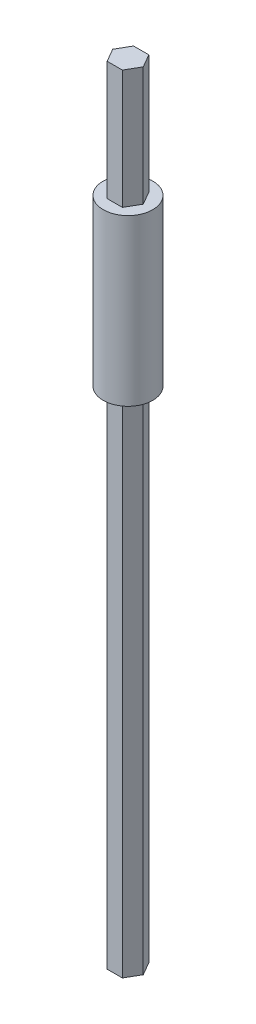
ISO-10303-21;
HEADER;
FILE_DESCRIPTION(('STEP AP214'),'2;1');
FILE_NAME('part.step','',(''),(''),'','','');
FILE_SCHEMA(('AUTOMOTIVE_DESIGN { 1 0 10303 214 1 1 1 1 }'));
ENDSEC;
DATA;
#1=APPLICATION_CONTEXT('core data for automotive mechanical design processes');
#2=APPLICATION_PROTOCOL_DEFINITION('international standard','automotive_design',2000,#1);
#3=PRODUCT_CONTEXT('',#1,'mechanical');
#4=PRODUCT('Part','Part','',(#3));
#5=PRODUCT_RELATED_PRODUCT_CATEGORY('part','',(#4));
#6=PRODUCT_DEFINITION_FORMATION('','',#4);
#7=PRODUCT_DEFINITION_CONTEXT('part definition',#1,'design');
#8=PRODUCT_DEFINITION('design','',#6,#7);
#9=PRODUCT_DEFINITION_SHAPE('','',#8);
#10=(LENGTH_UNIT() NAMED_UNIT(*) SI_UNIT(.MILLI.,.METRE.));
#11=(NAMED_UNIT(*) PLANE_ANGLE_UNIT() SI_UNIT($,.RADIAN.));
#12=(NAMED_UNIT(*) SI_UNIT($,.STERADIAN.) SOLID_ANGLE_UNIT());
#13=UNCERTAINTY_MEASURE_WITH_UNIT(LENGTH_MEASURE(1.E-05),#10,'distance_accuracy_value','');
#14=(GEOMETRIC_REPRESENTATION_CONTEXT(3) GLOBAL_UNCERTAINTY_ASSIGNED_CONTEXT((#13)) GLOBAL_UNIT_ASSIGNED_CONTEXT((#10,
#11,#12)) REPRESENTATION_CONTEXT('',''));
#15=CARTESIAN_POINT('',(0.,0.,0.));
#16=DIRECTION('',(0.,0.,1.));
#17=DIRECTION('',(1.,0.,0.));
#18=AXIS2_PLACEMENT_3D('',#15,#16,#17);
#19=CARTESIAN_POINT('',(1.5556349186104,71.3,-1.5556349186104));
#20=DIRECTION('',(0.,1.,0.));
#21=DIRECTION('',(0.,0.,1.));
#22=AXIS2_PLACEMENT_3D('',#19,#20,#21);
#23=PLANE('',#22);
#24=CARTESIAN_POINT('',(1.5556349186104,71.3,-1.5556349186104));
#25=DIRECTION('',(0.,1.,0.));
#26=DIRECTION('',(0.,0.,1.));
#27=AXIS2_PLACEMENT_3D('',#24,#25,#26);
#28=CIRCLE('',#27,3.75);
#29=CARTESIAN_POINT('',(1.5556349186104,71.3,2.1943650813896));
#30=VERTEX_POINT('',#29);
#31=EDGE_CURVE('E37',#30,#30,#28,.T.);
#32=ORIENTED_EDGE('',*,*,#31,.F.);
#33=EDGE_LOOP('',(#32));
#34=FACE_BOUND('',#33,.T.);
#35=DIRECTION('',(0.5,0.,0.866025403784439));
#36=VECTOR('',#35,1.);
#37=CARTESIAN_POINT('',(2.71033545698966,71.3,-3.55563491861041));
#38=LINE('',#37,#36);
#39=CARTESIAN_POINT('',(2.71033545698966,71.3,-3.55563491861041));
#40=VERTEX_POINT('',#39);
#41=CARTESIAN_POINT('',(3.86503599536891,71.3,-1.5556349186104));
#42=VERTEX_POINT('',#41);
#43=EDGE_CURVE('E142',#40,#42,#38,.T.);
#44=ORIENTED_EDGE('',*,*,#43,.F.);
#45=DIRECTION('',(1.,0.,0.));
#46=VECTOR('',#45,1.);
#47=CARTESIAN_POINT('',(0.400934380231152,71.3,-3.5556349186104));
#48=LINE('',#47,#46);
#49=CARTESIAN_POINT('',(0.400934380231152,71.3,-3.55563491861041));
#50=VERTEX_POINT('',#49);
#51=EDGE_CURVE('E139',#50,#40,#48,.T.);
#52=ORIENTED_EDGE('',*,*,#51,.F.);
#53=DIRECTION('',(0.5,0.,-0.866025403784438));
#54=VECTOR('',#53,1.);
#55=CARTESIAN_POINT('',(-0.7537661581481,71.3,-1.55563491861041));
#56=LINE('',#55,#54);
#57=CARTESIAN_POINT('',(-0.753766158148099,71.3,-1.55563491861041));
#58=VERTEX_POINT('',#57);
#59=EDGE_CURVE('E207',#58,#50,#56,.T.);
#60=ORIENTED_EDGE('',*,*,#59,.F.);
#61=DIRECTION('',(-0.5,0.,-0.866025403784439));
#62=VECTOR('',#61,1.);
#63=CARTESIAN_POINT('',(0.400934380231152,71.3,0.444365081389597));
#64=LINE('',#63,#62);
#65=CARTESIAN_POINT('',(0.400934380231153,71.3,0.444365081389597));
#66=VERTEX_POINT('',#65);
#67=EDGE_CURVE('E224',#66,#58,#64,.T.);
#68=ORIENTED_EDGE('',*,*,#67,.F.);
#69=DIRECTION('',(-1.,0.,0.));
#70=VECTOR('',#69,1.);
#71=CARTESIAN_POINT('',(2.71033545698965,71.3,0.444365081389597));
#72=LINE('',#71,#70);
#73=CARTESIAN_POINT('',(2.71033545698965,71.3,0.444365081389597));
#74=VERTEX_POINT('',#73);
#75=EDGE_CURVE('E53',#74,#66,#72,.T.);
#76=ORIENTED_EDGE('',*,*,#75,.F.);
#77=DIRECTION('',(-0.5,0.,0.866025403784438));
#78=VECTOR('',#77,1.);
#79=CARTESIAN_POINT('',(3.86503599536891,71.3,-1.5556349186104));
#80=LINE('',#79,#78);
#81=EDGE_CURVE('E48',#42,#74,#80,.T.);
#82=ORIENTED_EDGE('',*,*,#81,.F.);
#83=EDGE_LOOP('',(#44,#52,#60,#68,#76,#82));
#84=FACE_BOUND('',#83,.T.);
#85=ADVANCED_FACE('F33',(#34,#84),#23,.F.);
#86=CARTESIAN_POINT('',(1.5556349186104,96.3,-1.5556349186104));
#87=DIRECTION('',(0.,1.,0.));
#88=DIRECTION('',(0.,0.,1.));
#89=AXIS2_PLACEMENT_3D('',#86,#87,#88);
#90=PLANE('',#89);
#91=CARTESIAN_POINT('',(1.5556349186104,96.3,-1.5556349186104));
#92=DIRECTION('',(0.,1.,0.));
#93=DIRECTION('',(0.,0.,1.));
#94=AXIS2_PLACEMENT_3D('',#91,#92,#93);
#95=CIRCLE('',#94,3.75);
#96=CARTESIAN_POINT('',(1.5556349186104,96.3,2.1943650813896));
#97=VERTEX_POINT('',#96);
#98=EDGE_CURVE('E11',#97,#97,#95,.T.);
#99=ORIENTED_EDGE('',*,*,#98,.T.);
#100=EDGE_LOOP('',(#99));
#101=FACE_BOUND('',#100,.T.);
#102=DIRECTION('',(-0.5,0.,-0.866025403784439));
#103=VECTOR('',#102,1.);
#104=CARTESIAN_POINT('',(3.86503599536891,96.3,-1.55563491861041));
#105=LINE('',#104,#103);
#106=CARTESIAN_POINT('',(3.86503599536891,96.3,-1.55563491861041));
#107=VERTEX_POINT('',#106);
#108=CARTESIAN_POINT('',(2.71033545698966,96.3,-3.55563491861041));
#109=VERTEX_POINT('',#108);
#110=EDGE_CURVE('E146',#107,#109,#105,.T.);
#111=ORIENTED_EDGE('',*,*,#110,.F.);
#112=DIRECTION('',(0.5,0.,-0.866025403784439));
#113=VECTOR('',#112,1.);
#114=CARTESIAN_POINT('',(2.71033545698966,96.3,0.444365081389596));
#115=LINE('',#114,#113);
#116=CARTESIAN_POINT('',(2.71033545698966,96.3,0.444365081389596));
#117=VERTEX_POINT('',#116);
#118=EDGE_CURVE('E143',#117,#107,#115,.T.);
#119=ORIENTED_EDGE('',*,*,#118,.F.);
#120=DIRECTION('',(1.,0.,0.));
#121=VECTOR('',#120,1.);
#122=CARTESIAN_POINT('',(0.400934380231153,96.3,0.444365081389596));
#123=LINE('',#122,#121);
#124=CARTESIAN_POINT('',(0.400934380231152,96.3,0.444365081389596));
#125=VERTEX_POINT('',#124);
#126=EDGE_CURVE('E156',#125,#117,#123,.T.);
#127=ORIENTED_EDGE('',*,*,#126,.F.);
#128=DIRECTION('',(0.5,0.,0.866025403784438));
#129=VECTOR('',#128,1.);
#130=CARTESIAN_POINT('',(-0.753766158148099,96.3,-1.5556349186104));
#131=LINE('',#130,#129);
#132=CARTESIAN_POINT('',(-0.753766158148099,96.3,-1.5556349186104));
#133=VERTEX_POINT('',#132);
#134=EDGE_CURVE('E172',#133,#125,#131,.T.);
#135=ORIENTED_EDGE('',*,*,#134,.F.);
#136=DIRECTION('',(-0.5,0.,0.866025403784439));
#137=VECTOR('',#136,1.);
#138=CARTESIAN_POINT('',(0.400934380231153,96.3,-3.55563491861041));
#139=LINE('',#138,#137);
#140=CARTESIAN_POINT('',(0.400934380231153,96.3,-3.55563491861041));
#141=VERTEX_POINT('',#140);
#142=EDGE_CURVE('E170',#141,#133,#139,.T.);
#143=ORIENTED_EDGE('',*,*,#142,.F.);
#144=DIRECTION('',(-1.,0.,0.));
#145=VECTOR('',#144,1.);
#146=CARTESIAN_POINT('',(2.71033545698966,96.3,-3.55563491861041));
#147=LINE('',#146,#145);
#148=EDGE_CURVE('E168',#109,#141,#147,.T.);
#149=ORIENTED_EDGE('',*,*,#148,.F.);
#150=EDGE_LOOP('',(#111,#119,#127,#135,#143,#149));
#151=FACE_BOUND('',#150,.T.);
#152=ADVANCED_FACE('F197',(#101,#151),#90,.T.);
#153=CARTESIAN_POINT('',(1.5556349186104,96.3,-1.5556349186104));
#154=DIRECTION('',(0.,-1.,0.));
#155=DIRECTION('',(0.,0.,-1.));
#156=AXIS2_PLACEMENT_3D('',#153,#154,#155);
#157=CYLINDRICAL_SURFACE('',#156,3.75);
#158=ORIENTED_EDGE('',*,*,#98,.F.);
#159=EDGE_LOOP('',(#158));
#160=FACE_BOUND('',#159,.T.);
#161=ORIENTED_EDGE('',*,*,#31,.T.);
#162=EDGE_LOOP('',(#161));
#163=FACE_BOUND('',#162,.T.);
#164=ADVANCED_FACE('F35',(#160,#163),#157,.T.);
#165=CARTESIAN_POINT('',(2.71033545698966,114.3,0.444365081389596));
#166=DIRECTION('',(-0.866025403784439,0.,-0.5));
#167=DIRECTION('',(-0.5,0.,0.866025403784439));
#168=AXIS2_PLACEMENT_3D('',#165,#166,#167);
#169=PLANE('',#168);
#170=ORIENTED_EDGE('',*,*,#118,.T.);
#171=DIRECTION('',(0.,-1.,0.));
#172=VECTOR('',#171,1.);
#173=CARTESIAN_POINT('',(3.86503599536891,114.3,-1.55563491861041));
#174=LINE('',#173,#172);
#175=CARTESIAN_POINT('',(3.86503599536891,114.3,-1.55563491861041));
#176=VERTEX_POINT('',#175);
#177=EDGE_CURVE('E189',#176,#107,#174,.T.);
#178=ORIENTED_EDGE('',*,*,#177,.F.);
#179=DIRECTION('',(0.5,0.,-0.866025403784439));
#180=VECTOR('',#179,1.);
#181=CARTESIAN_POINT('',(2.71033545698966,114.3,0.444365081389596));
#182=LINE('',#181,#180);
#183=CARTESIAN_POINT('',(2.71033545698966,114.3,0.444365081389596));
#184=VERTEX_POINT('',#183);
#185=EDGE_CURVE('E152',#184,#176,#182,.T.);
#186=ORIENTED_EDGE('',*,*,#185,.F.);
#187=DIRECTION('',(0.,-1.,0.));
#188=VECTOR('',#187,1.);
#189=CARTESIAN_POINT('',(2.71033545698966,114.3,0.444365081389596));
#190=LINE('',#189,#188);
#191=EDGE_CURVE('E165',#184,#117,#190,.T.);
#192=ORIENTED_EDGE('',*,*,#191,.T.);
#193=EDGE_LOOP('',(#170,#178,#186,#192));
#194=FACE_BOUND('',#193,.T.);
#195=ADVANCED_FACE('F276',(#194),#169,.F.);
#196=CARTESIAN_POINT('',(3.86503599536891,114.3,-1.55563491861041));
#197=DIRECTION('',(-0.866025403784439,0.,0.5));
#198=DIRECTION('',(0.5,0.,0.866025403784439));
#199=AXIS2_PLACEMENT_3D('',#196,#197,#198);
#200=PLANE('',#199);
#201=ORIENTED_EDGE('',*,*,#110,.T.);
#202=DIRECTION('',(0.,-1.,0.));
#203=VECTOR('',#202,1.);
#204=CARTESIAN_POINT('',(2.71033545698966,114.3,-3.55563491861041));
#205=LINE('',#204,#203);
#206=CARTESIAN_POINT('',(2.71033545698966,114.3,-3.55563491861041));
#207=VERTEX_POINT('',#206);
#208=EDGE_CURVE('E186',#207,#109,#205,.T.);
#209=ORIENTED_EDGE('',*,*,#208,.F.);
#210=DIRECTION('',(-0.5,0.,-0.866025403784439));
#211=VECTOR('',#210,1.);
#212=CARTESIAN_POINT('',(3.86503599536891,114.3,-1.55563491861041));
#213=LINE('',#212,#211);
#214=EDGE_CURVE('E155',#176,#207,#213,.T.);
#215=ORIENTED_EDGE('',*,*,#214,.F.);
#216=ORIENTED_EDGE('',*,*,#177,.T.);
#217=EDGE_LOOP('',(#201,#209,#215,#216));
#218=FACE_BOUND('',#217,.T.);
#219=ADVANCED_FACE('F272',(#218),#200,.F.);
#220=CARTESIAN_POINT('',(2.71033545698966,114.3,-3.55563491861041));
#221=DIRECTION('',(0.,0.,1.));
#222=DIRECTION('',(1.,0.,0.));
#223=AXIS2_PLACEMENT_3D('',#220,#221,#222);
#224=PLANE('',#223);
#225=ORIENTED_EDGE('',*,*,#148,.T.);
#226=DIRECTION('',(0.,-1.,0.));
#227=VECTOR('',#226,1.);
#228=CARTESIAN_POINT('',(0.400934380231153,114.3,-3.55563491861041));
#229=LINE('',#228,#227);
#230=CARTESIAN_POINT('',(0.400934380231153,114.3,-3.55563491861041));
#231=VERTEX_POINT('',#230);
#232=EDGE_CURVE('E183',#231,#141,#229,.T.);
#233=ORIENTED_EDGE('',*,*,#232,.F.);
#234=DIRECTION('',(-1.,0.,0.));
#235=VECTOR('',#234,1.);
#236=CARTESIAN_POINT('',(2.71033545698966,114.3,-3.55563491861041));
#237=LINE('',#236,#235);
#238=EDGE_CURVE('E158',#207,#231,#237,.T.);
#239=ORIENTED_EDGE('',*,*,#238,.F.);
#240=ORIENTED_EDGE('',*,*,#208,.T.);
#241=EDGE_LOOP('',(#225,#233,#239,#240));
#242=FACE_BOUND('',#241,.T.);
#243=ADVANCED_FACE('F268',(#242),#224,.F.);
#244=CARTESIAN_POINT('',(0.400934380231153,114.3,-3.55563491861041));
#245=DIRECTION('',(0.866025403784439,0.,0.5));
#246=DIRECTION('',(0.5,0.,-0.866025403784439));
#247=AXIS2_PLACEMENT_3D('',#244,#245,#246);
#248=PLANE('',#247);
#249=ORIENTED_EDGE('',*,*,#142,.T.);
#250=DIRECTION('',(0.,-1.,0.));
#251=VECTOR('',#250,1.);
#252=CARTESIAN_POINT('',(-0.753766158148099,114.3,-1.5556349186104));
#253=LINE('',#252,#251);
#254=CARTESIAN_POINT('',(-0.753766158148099,114.3,-1.5556349186104));
#255=VERTEX_POINT('',#254);
#256=EDGE_CURVE('E180',#255,#133,#253,.T.);
#257=ORIENTED_EDGE('',*,*,#256,.F.);
#258=DIRECTION('',(-0.5,0.,0.866025403784439));
#259=VECTOR('',#258,1.);
#260=CARTESIAN_POINT('',(0.400934380231153,114.3,-3.55563491861041));
#261=LINE('',#260,#259);
#262=EDGE_CURVE('E160',#231,#255,#261,.T.);
#263=ORIENTED_EDGE('',*,*,#262,.F.);
#264=ORIENTED_EDGE('',*,*,#232,.T.);
#265=EDGE_LOOP('',(#249,#257,#263,#264));
#266=FACE_BOUND('',#265,.T.);
#267=ADVANCED_FACE('F264',(#266),#248,.F.);
#268=CARTESIAN_POINT('',(-0.753766158148099,114.3,-1.5556349186104));
#269=DIRECTION('',(0.866025403784439,0.,-0.5));
#270=DIRECTION('',(-0.5,0.,-0.866025403784439));
#271=AXIS2_PLACEMENT_3D('',#268,#269,#270);
#272=PLANE('',#271);
#273=ORIENTED_EDGE('',*,*,#134,.T.);
#274=DIRECTION('',(0.,-1.,0.));
#275=VECTOR('',#274,1.);
#276=CARTESIAN_POINT('',(0.400934380231153,114.3,0.444365081389596));
#277=LINE('',#276,#275);
#278=CARTESIAN_POINT('',(0.400934380231153,114.3,0.444365081389596));
#279=VERTEX_POINT('',#278);
#280=EDGE_CURVE('E178',#279,#125,#277,.T.);
#281=ORIENTED_EDGE('',*,*,#280,.F.);
#282=DIRECTION('',(0.5,0.,0.866025403784438));
#283=VECTOR('',#282,1.);
#284=CARTESIAN_POINT('',(-0.753766158148099,114.3,-1.5556349186104));
#285=LINE('',#284,#283);
#286=EDGE_CURVE('E162',#255,#279,#285,.T.);
#287=ORIENTED_EDGE('',*,*,#286,.F.);
#288=ORIENTED_EDGE('',*,*,#256,.T.);
#289=EDGE_LOOP('',(#273,#281,#287,#288));
#290=FACE_BOUND('',#289,.T.);
#291=ADVANCED_FACE('F260',(#290),#272,.F.);
#292=CARTESIAN_POINT('',(0.400934380231153,114.3,0.444365081389596));
#293=DIRECTION('',(0.,0.,-1.));
#294=DIRECTION('',(-1.,0.,0.));
#295=AXIS2_PLACEMENT_3D('',#292,#293,#294);
#296=PLANE('',#295);
#297=ORIENTED_EDGE('',*,*,#126,.T.);
#298=ORIENTED_EDGE('',*,*,#191,.F.);
#299=DIRECTION('',(1.,0.,0.));
#300=VECTOR('',#299,1.);
#301=CARTESIAN_POINT('',(0.400934380231153,114.3,0.444365081389596));
#302=LINE('',#301,#300);
#303=EDGE_CURVE('E164',#279,#184,#302,.T.);
#304=ORIENTED_EDGE('',*,*,#303,.F.);
#305=ORIENTED_EDGE('',*,*,#280,.T.);
#306=EDGE_LOOP('',(#297,#298,#304,#305));
#307=FACE_BOUND('',#306,.T.);
#308=ADVANCED_FACE('F256',(#307),#296,.F.);
#309=CARTESIAN_POINT('',(0.,114.3,0.));
#310=DIRECTION('',(0.,1.,0.));
#311=DIRECTION('',(0.,0.,1.));
#312=AXIS2_PLACEMENT_3D('',#309,#310,#311);
#313=PLANE('',#312);
#314=ORIENTED_EDGE('',*,*,#185,.T.);
#315=ORIENTED_EDGE('',*,*,#214,.T.);
#316=ORIENTED_EDGE('',*,*,#238,.T.);
#317=ORIENTED_EDGE('',*,*,#262,.T.);
#318=ORIENTED_EDGE('',*,*,#286,.T.);
#319=ORIENTED_EDGE('',*,*,#303,.T.);
#320=EDGE_LOOP('',(#314,#315,#316,#317,#318,#319));
#321=FACE_BOUND('',#320,.T.);
#322=ADVANCED_FACE('F253',(#321),#313,.T.);
#323=CARTESIAN_POINT('',(2.71033545698966,-4.7,-3.55563491861041));
#324=DIRECTION('',(-0.866025403784439,0.,0.5));
#325=DIRECTION('',(0.5,0.,0.866025403784439));
#326=AXIS2_PLACEMENT_3D('',#323,#324,#325);
#327=PLANE('',#326);
#328=ORIENTED_EDGE('',*,*,#43,.T.);
#329=DIRECTION('',(0.,1.,0.));
#330=VECTOR('',#329,1.);
#331=CARTESIAN_POINT('',(3.86503599536891,-4.7,-1.5556349186104));
#332=LINE('',#331,#330);
#333=CARTESIAN_POINT('',(3.86503599536891,-4.7,-1.5556349186104));
#334=VERTEX_POINT('',#333);
#335=EDGE_CURVE('E123',#334,#42,#332,.T.);
#336=ORIENTED_EDGE('',*,*,#335,.F.);
#337=DIRECTION('',(0.5,0.,0.866025403784439));
#338=VECTOR('',#337,1.);
#339=CARTESIAN_POINT('',(2.71033545698966,-4.7,-3.55563491861041));
#340=LINE('',#339,#338);
#341=CARTESIAN_POINT('',(2.71033545698966,-4.7,-3.55563491861041));
#342=VERTEX_POINT('',#341);
#343=EDGE_CURVE('E130',#342,#334,#340,.T.);
#344=ORIENTED_EDGE('',*,*,#343,.F.);
#345=DIRECTION('',(0.,1.,0.));
#346=VECTOR('',#345,1.);
#347=CARTESIAN_POINT('',(2.71033545698966,-4.7,-3.55563491861041));
#348=LINE('',#347,#346);
#349=EDGE_CURVE('E204',#342,#40,#348,.T.);
#350=ORIENTED_EDGE('',*,*,#349,.T.);
#351=EDGE_LOOP('',(#328,#336,#344,#350));
#352=FACE_BOUND('',#351,.T.);
#353=ADVANCED_FACE('F141',(#352),#327,.F.);
#354=CARTESIAN_POINT('',(3.86503599536891,-4.7,-1.5556349186104));
#355=DIRECTION('',(-0.866025403784438,0.,-0.5));
#356=DIRECTION('',(-0.5,0.,0.866025403784438));
#357=AXIS2_PLACEMENT_3D('',#354,#355,#356);
#358=PLANE('',#357);
#359=ORIENTED_EDGE('',*,*,#81,.T.);
#360=DIRECTION('',(0.,1.,0.));
#361=VECTOR('',#360,1.);
#362=CARTESIAN_POINT('',(2.71033545698965,-4.7,0.444365081389597));
#363=LINE('',#362,#361);
#364=CARTESIAN_POINT('',(2.71033545698965,-4.7,0.444365081389597));
#365=VERTEX_POINT('',#364);
#366=EDGE_CURVE('E126',#365,#74,#363,.T.);
#367=ORIENTED_EDGE('',*,*,#366,.F.);
#368=DIRECTION('',(-0.5,0.,0.866025403784438));
#369=VECTOR('',#368,1.);
#370=CARTESIAN_POINT('',(3.86503599536891,-4.7,-1.5556349186104));
#371=LINE('',#370,#369);
#372=EDGE_CURVE('E119',#334,#365,#371,.T.);
#373=ORIENTED_EDGE('',*,*,#372,.F.);
#374=ORIENTED_EDGE('',*,*,#335,.T.);
#375=EDGE_LOOP('',(#359,#367,#373,#374));
#376=FACE_BOUND('',#375,.T.);
#377=ADVANCED_FACE('F121',(#376),#358,.F.);
#378=CARTESIAN_POINT('',(2.71033545698965,-4.7,0.444365081389597));
#379=DIRECTION('',(0.,0.,-1.));
#380=DIRECTION('',(-1.,0.,0.));
#381=AXIS2_PLACEMENT_3D('',#378,#379,#380);
#382=PLANE('',#381);
#383=ORIENTED_EDGE('',*,*,#75,.T.);
#384=DIRECTION('',(0.,1.,0.));
#385=VECTOR('',#384,1.);
#386=CARTESIAN_POINT('',(0.400934380231152,-4.7,0.444365081389597));
#387=LINE('',#386,#385);
#388=CARTESIAN_POINT('',(0.400934380231152,-4.7,0.444365081389597));
#389=VERTEX_POINT('',#388);
#390=EDGE_CURVE('E148',#389,#66,#387,.T.);
#391=ORIENTED_EDGE('',*,*,#390,.F.);
#392=DIRECTION('',(-1.,0.,0.));
#393=VECTOR('',#392,1.);
#394=CARTESIAN_POINT('',(2.71033545698965,-4.7,0.444365081389597));
#395=LINE('',#394,#393);
#396=EDGE_CURVE('E129',#365,#389,#395,.T.);
#397=ORIENTED_EDGE('',*,*,#396,.F.);
#398=ORIENTED_EDGE('',*,*,#366,.T.);
#399=EDGE_LOOP('',(#383,#391,#397,#398));
#400=FACE_BOUND('',#399,.T.);
#401=ADVANCED_FACE('F227',(#400),#382,.F.);
#402=CARTESIAN_POINT('',(0.400934380231152,-4.7,0.444365081389597));
#403=DIRECTION('',(0.866025403784439,0.,-0.5));
#404=DIRECTION('',(-0.5,0.,-0.866025403784439));
#405=AXIS2_PLACEMENT_3D('',#402,#403,#404);
#406=PLANE('',#405);
#407=ORIENTED_EDGE('',*,*,#67,.T.);
#408=DIRECTION('',(0.,1.,0.));
#409=VECTOR('',#408,1.);
#410=CARTESIAN_POINT('',(-0.7537661581481,-4.7,-1.55563491861041));
#411=LINE('',#410,#409);
#412=CARTESIAN_POINT('',(-0.7537661581481,-4.7,-1.55563491861041));
#413=VERTEX_POINT('',#412);
#414=EDGE_CURVE('E210',#413,#58,#411,.T.);
#415=ORIENTED_EDGE('',*,*,#414,.F.);
#416=DIRECTION('',(-0.5,0.,-0.866025403784439));
#417=VECTOR('',#416,1.);
#418=CARTESIAN_POINT('',(0.400934380231152,-4.7,0.444365081389597));
#419=LINE('',#418,#417);
#420=EDGE_CURVE('E225',#389,#413,#419,.T.);
#421=ORIENTED_EDGE('',*,*,#420,.F.);
#422=ORIENTED_EDGE('',*,*,#390,.T.);
#423=EDGE_LOOP('',(#407,#415,#421,#422));
#424=FACE_BOUND('',#423,.T.);
#425=ADVANCED_FACE('F222',(#424),#406,.F.);
#426=CARTESIAN_POINT('',(-0.7537661581481,-4.7,-1.55563491861041));
#427=DIRECTION('',(0.866025403784438,0.,0.5));
#428=DIRECTION('',(0.5,0.,-0.866025403784439));
#429=AXIS2_PLACEMENT_3D('',#426,#427,#428);
#430=PLANE('',#429);
#431=ORIENTED_EDGE('',*,*,#59,.T.);
#432=DIRECTION('',(0.,1.,0.));
#433=VECTOR('',#432,1.);
#434=CARTESIAN_POINT('',(0.400934380231152,-4.7,-3.5556349186104));
#435=LINE('',#434,#433);
#436=CARTESIAN_POINT('',(0.400934380231152,-4.7,-3.5556349186104));
#437=VERTEX_POINT('',#436);
#438=EDGE_CURVE('E206',#437,#50,#435,.T.);
#439=ORIENTED_EDGE('',*,*,#438,.F.);
#440=DIRECTION('',(0.5,0.,-0.866025403784438));
#441=VECTOR('',#440,1.);
#442=CARTESIAN_POINT('',(-0.7537661581481,-4.7,-1.55563491861041));
#443=LINE('',#442,#441);
#444=EDGE_CURVE('E212',#413,#437,#443,.T.);
#445=ORIENTED_EDGE('',*,*,#444,.F.);
#446=ORIENTED_EDGE('',*,*,#414,.T.);
#447=EDGE_LOOP('',(#431,#439,#445,#446));
#448=FACE_BOUND('',#447,.T.);
#449=ADVANCED_FACE('F232',(#448),#430,.F.);
#450=CARTESIAN_POINT('',(0.400934380231152,-4.7,-3.5556349186104));
#451=DIRECTION('',(0.,0.,1.));
#452=DIRECTION('',(1.,0.,0.));
#453=AXIS2_PLACEMENT_3D('',#450,#451,#452);
#454=PLANE('',#453);
#455=ORIENTED_EDGE('',*,*,#51,.T.);
#456=ORIENTED_EDGE('',*,*,#349,.F.);
#457=DIRECTION('',(1.,0.,0.));
#458=VECTOR('',#457,1.);
#459=CARTESIAN_POINT('',(0.400934380231152,-4.7,-3.5556349186104));
#460=LINE('',#459,#458);
#461=EDGE_CURVE('E135',#437,#342,#460,.T.);
#462=ORIENTED_EDGE('',*,*,#461,.F.);
#463=ORIENTED_EDGE('',*,*,#438,.T.);
#464=EDGE_LOOP('',(#455,#456,#462,#463));
#465=FACE_BOUND('',#464,.T.);
#466=ADVANCED_FACE('F203',(#465),#454,.F.);
#467=CARTESIAN_POINT('',(0.,-4.7,0.));
#468=DIRECTION('',(0.,-1.,0.));
#469=DIRECTION('',(0.,0.,-1.));
#470=AXIS2_PLACEMENT_3D('',#467,#468,#469);
#471=PLANE('',#470);
#472=ORIENTED_EDGE('',*,*,#343,.T.);
#473=ORIENTED_EDGE('',*,*,#372,.T.);
#474=ORIENTED_EDGE('',*,*,#396,.T.);
#475=ORIENTED_EDGE('',*,*,#420,.T.);
#476=ORIENTED_EDGE('',*,*,#444,.T.);
#477=ORIENTED_EDGE('',*,*,#461,.T.);
#478=EDGE_LOOP('',(#472,#473,#474,#475,#476,#477));
#479=FACE_BOUND('',#478,.T.);
#480=ADVANCED_FACE('F133',(#479),#471,.T.);
#481=CLOSED_SHELL('',(#85,#152,#164,#195,#219,#243,#267,#291,#308,#322,#353,#377,#401,#425,#449,
#466,#480));
#482=MANIFOLD_SOLID_BREP('B2',#481);
#483=ADVANCED_BREP_SHAPE_REPRESENTATION('',(#18,#482),#14);
#484=SHAPE_DEFINITION_REPRESENTATION(#9,#483);
ENDSEC;
END-ISO-10303-21;
